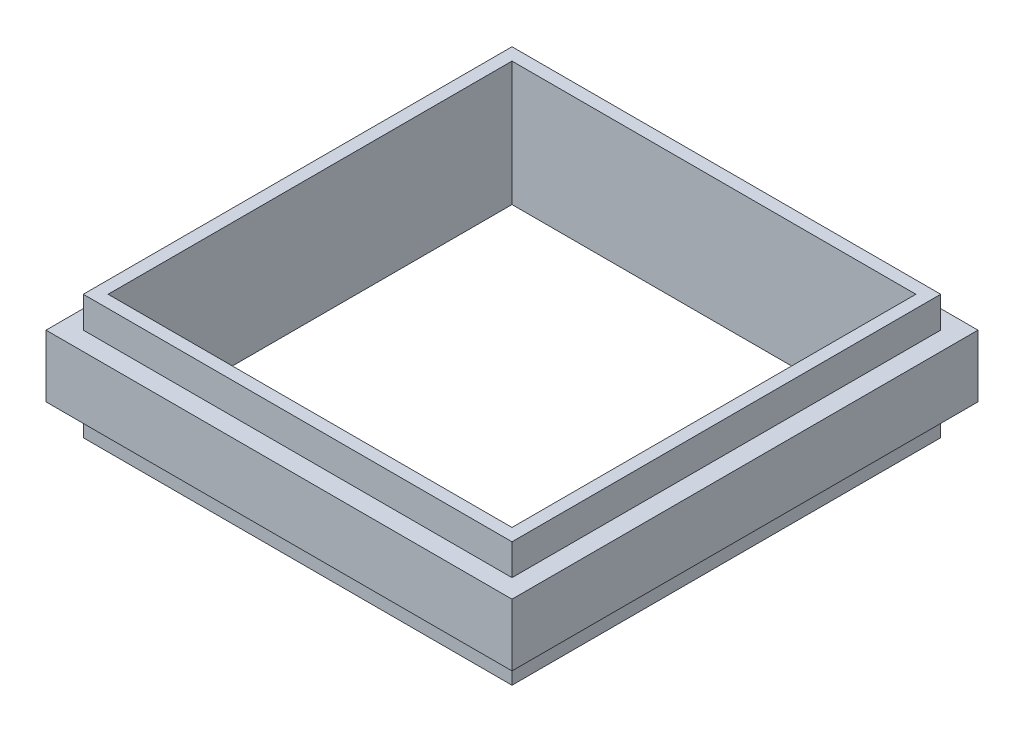
ISO-10303-21;
HEADER;
FILE_DESCRIPTION(('STEP AP214'),'2;1');
FILE_NAME('part.step','',(''),(''),'','','');
FILE_SCHEMA(('AUTOMOTIVE_DESIGN { 1 0 10303 214 1 1 1 1 }'));
ENDSEC;
DATA;
#1=APPLICATION_CONTEXT('core data for automotive mechanical design processes');
#2=APPLICATION_PROTOCOL_DEFINITION('international standard','automotive_design',2000,#1);
#3=PRODUCT_CONTEXT('',#1,'mechanical');
#4=PRODUCT('Part','Part','',(#3));
#5=PRODUCT_RELATED_PRODUCT_CATEGORY('part','',(#4));
#6=PRODUCT_DEFINITION_FORMATION('','',#4);
#7=PRODUCT_DEFINITION_CONTEXT('part definition',#1,'design');
#8=PRODUCT_DEFINITION('design','',#6,#7);
#9=PRODUCT_DEFINITION_SHAPE('','',#8);
#10=(LENGTH_UNIT() NAMED_UNIT(*) SI_UNIT(.MILLI.,.METRE.));
#11=(NAMED_UNIT(*) PLANE_ANGLE_UNIT() SI_UNIT($,.RADIAN.));
#12=(NAMED_UNIT(*) SI_UNIT($,.STERADIAN.) SOLID_ANGLE_UNIT());
#13=UNCERTAINTY_MEASURE_WITH_UNIT(LENGTH_MEASURE(1.E-05),#10,'distance_accuracy_value','');
#14=(GEOMETRIC_REPRESENTATION_CONTEXT(3) GLOBAL_UNCERTAINTY_ASSIGNED_CONTEXT((#13)) GLOBAL_UNIT_ASSIGNED_CONTEXT((#10,
#11,#12)) REPRESENTATION_CONTEXT('',''));
#15=CARTESIAN_POINT('',(0.,0.,0.));
#16=DIRECTION('',(0.,0.,1.));
#17=DIRECTION('',(1.,0.,0.));
#18=AXIS2_PLACEMENT_3D('',#15,#16,#17);
#19=CARTESIAN_POINT('',(0.,20.,0.));
#20=DIRECTION('',(0.,-1.,0.));
#21=DIRECTION('',(0.,0.,-1.));
#22=AXIS2_PLACEMENT_3D('',#19,#20,#21);
#23=PLANE('',#22);
#24=DIRECTION('',(0.,0.,-1.));
#25=VECTOR('',#24,1.);
#26=CARTESIAN_POINT('',(75.,20.,75.));
#27=LINE('',#26,#25);
#28=CARTESIAN_POINT('',(75.,20.,75.));
#29=VERTEX_POINT('',#28);
#30=CARTESIAN_POINT('',(75.,20.,-75.));
#31=VERTEX_POINT('',#30);
#32=EDGE_CURVE('E252',#29,#31,#27,.T.);
#33=ORIENTED_EDGE('',*,*,#32,.T.);
#34=DIRECTION('',(-1.,0.,0.));
#35=VECTOR('',#34,1.);
#36=CARTESIAN_POINT('',(-75.,20.,-75.));
#37=LINE('',#36,#35);
#38=CARTESIAN_POINT('',(-75.,20.,-75.));
#39=VERTEX_POINT('',#38);
#40=EDGE_CURVE('E255',#31,#39,#37,.T.);
#41=ORIENTED_EDGE('',*,*,#40,.T.);
#42=DIRECTION('',(0.,0.,1.));
#43=VECTOR('',#42,1.);
#44=CARTESIAN_POINT('',(-75.,20.,75.));
#45=LINE('',#44,#43);
#46=CARTESIAN_POINT('',(-75.,20.,75.));
#47=VERTEX_POINT('',#46);
#48=EDGE_CURVE('E258',#39,#47,#45,.T.);
#49=ORIENTED_EDGE('',*,*,#48,.T.);
#50=DIRECTION('',(1.,0.,0.));
#51=VECTOR('',#50,1.);
#52=CARTESIAN_POINT('',(-75.,20.,75.));
#53=LINE('',#52,#51);
#54=EDGE_CURVE('E260',#47,#29,#53,.T.);
#55=ORIENTED_EDGE('',*,*,#54,.T.);
#56=EDGE_LOOP('',(#33,#41,#49,#55));
#57=FACE_BOUND('',#56,.T.);
#58=DIRECTION('',(0.,0.,-1.));
#59=VECTOR('',#58,1.);
#60=CARTESIAN_POINT('',(69.,20.,69.));
#61=LINE('',#60,#59);
#62=CARTESIAN_POINT('',(69.,20.,69.));
#63=VERTEX_POINT('',#62);
#64=CARTESIAN_POINT('',(69.,20.,-69.));
#65=VERTEX_POINT('',#64);
#66=EDGE_CURVE('E218',#63,#65,#61,.T.);
#67=ORIENTED_EDGE('',*,*,#66,.F.);
#68=DIRECTION('',(1.,0.,0.));
#69=VECTOR('',#68,1.);
#70=CARTESIAN_POINT('',(-69.,20.,69.));
#71=LINE('',#70,#69);
#72=CARTESIAN_POINT('',(-69.,20.,69.));
#73=VERTEX_POINT('',#72);
#74=EDGE_CURVE('E223',#73,#63,#71,.T.);
#75=ORIENTED_EDGE('',*,*,#74,.F.);
#76=DIRECTION('',(0.,0.,1.));
#77=VECTOR('',#76,1.);
#78=CARTESIAN_POINT('',(-69.,20.,69.));
#79=LINE('',#78,#77);
#80=CARTESIAN_POINT('',(-69.,20.,-69.));
#81=VERTEX_POINT('',#80);
#82=EDGE_CURVE('E235',#81,#73,#79,.T.);
#83=ORIENTED_EDGE('',*,*,#82,.F.);
#84=DIRECTION('',(-1.,0.,0.));
#85=VECTOR('',#84,1.);
#86=CARTESIAN_POINT('',(-69.,20.,-69.));
#87=LINE('',#86,#85);
#88=EDGE_CURVE('E232',#65,#81,#87,.T.);
#89=ORIENTED_EDGE('',*,*,#88,.F.);
#90=EDGE_LOOP('',(#67,#75,#83,#89));
#91=FACE_BOUND('',#90,.T.);
#92=ADVANCED_FACE('F36',(#57,#91),#23,.F.);
#93=CARTESIAN_POINT('',(75.,20.,75.));
#94=DIRECTION('',(-1.,0.,0.));
#95=DIRECTION('',(0.,0.,1.));
#96=AXIS2_PLACEMENT_3D('',#93,#94,#95);
#97=PLANE('',#96);
#98=DIRECTION('',(0.,0.,-1.));
#99=VECTOR('',#98,1.);
#100=CARTESIAN_POINT('',(75.,0.,75.));
#101=LINE('',#100,#99);
#102=CARTESIAN_POINT('',(75.,0.,75.));
#103=VERTEX_POINT('',#102);
#104=CARTESIAN_POINT('',(75.,0.,-75.));
#105=VERTEX_POINT('',#104);
#106=EDGE_CURVE('E251',#103,#105,#101,.T.);
#107=ORIENTED_EDGE('',*,*,#106,.T.);
#108=DIRECTION('',(0.,-1.,0.));
#109=VECTOR('',#108,1.);
#110=CARTESIAN_POINT('',(75.,20.,-75.));
#111=LINE('',#110,#109);
#112=EDGE_CURVE('E11',#31,#105,#111,.T.);
#113=ORIENTED_EDGE('',*,*,#112,.F.);
#114=ORIENTED_EDGE('',*,*,#32,.F.);
#115=DIRECTION('',(0.,-1.,0.));
#116=VECTOR('',#115,1.);
#117=CARTESIAN_POINT('',(75.,20.,75.));
#118=LINE('',#117,#116);
#119=EDGE_CURVE('E262',#29,#103,#118,.T.);
#120=ORIENTED_EDGE('',*,*,#119,.T.);
#121=EDGE_LOOP('',(#107,#113,#114,#120));
#122=FACE_BOUND('',#121,.T.);
#123=ADVANCED_FACE('F38',(#122),#97,.F.);
#124=CARTESIAN_POINT('',(-75.,20.,-75.));
#125=DIRECTION('',(0.,0.,1.));
#126=DIRECTION('',(1.,0.,0.));
#127=AXIS2_PLACEMENT_3D('',#124,#125,#126);
#128=PLANE('',#127);
#129=DIRECTION('',(-1.,0.,0.));
#130=VECTOR('',#129,1.);
#131=CARTESIAN_POINT('',(-75.,0.,-75.));
#132=LINE('',#131,#130);
#133=CARTESIAN_POINT('',(-75.,0.,-75.));
#134=VERTEX_POINT('',#133);
#135=EDGE_CURVE('E265',#105,#134,#132,.T.);
#136=ORIENTED_EDGE('',*,*,#135,.T.);
#137=DIRECTION('',(0.,-1.,0.));
#138=VECTOR('',#137,1.);
#139=CARTESIAN_POINT('',(-75.,20.,-75.));
#140=LINE('',#139,#138);
#141=EDGE_CURVE('E44',#39,#134,#140,.T.);
#142=ORIENTED_EDGE('',*,*,#141,.F.);
#143=ORIENTED_EDGE('',*,*,#40,.F.);
#144=ORIENTED_EDGE('',*,*,#112,.T.);
#145=EDGE_LOOP('',(#136,#142,#143,#144));
#146=FACE_BOUND('',#145,.T.);
#147=ADVANCED_FACE('F295',(#146),#128,.F.);
#148=CARTESIAN_POINT('',(-75.,20.,75.));
#149=DIRECTION('',(1.,0.,0.));
#150=DIRECTION('',(0.,0.,-1.));
#151=AXIS2_PLACEMENT_3D('',#148,#149,#150);
#152=PLANE('',#151);
#153=DIRECTION('',(0.,0.,1.));
#154=VECTOR('',#153,1.);
#155=CARTESIAN_POINT('',(-75.,0.,75.));
#156=LINE('',#155,#154);
#157=CARTESIAN_POINT('',(-75.,0.,75.));
#158=VERTEX_POINT('',#157);
#159=EDGE_CURVE('E267',#134,#158,#156,.T.);
#160=ORIENTED_EDGE('',*,*,#159,.T.);
#161=DIRECTION('',(0.,-1.,0.));
#162=VECTOR('',#161,1.);
#163=CARTESIAN_POINT('',(-75.,20.,75.));
#164=LINE('',#163,#162);
#165=EDGE_CURVE('E272',#47,#158,#164,.T.);
#166=ORIENTED_EDGE('',*,*,#165,.F.);
#167=ORIENTED_EDGE('',*,*,#48,.F.);
#168=ORIENTED_EDGE('',*,*,#141,.T.);
#169=EDGE_LOOP('',(#160,#166,#167,#168));
#170=FACE_BOUND('',#169,.T.);
#171=ADVANCED_FACE('F279',(#170),#152,.F.);
#172=CARTESIAN_POINT('',(-75.,20.,75.));
#173=DIRECTION('',(0.,0.,-1.));
#174=DIRECTION('',(-1.,0.,0.));
#175=AXIS2_PLACEMENT_3D('',#172,#173,#174);
#176=PLANE('',#175);
#177=DIRECTION('',(1.,0.,0.));
#178=VECTOR('',#177,1.);
#179=CARTESIAN_POINT('',(-75.,0.,75.));
#180=LINE('',#179,#178);
#181=EDGE_CURVE('E256',#158,#103,#180,.T.);
#182=ORIENTED_EDGE('',*,*,#181,.T.);
#183=ORIENTED_EDGE('',*,*,#119,.F.);
#184=ORIENTED_EDGE('',*,*,#54,.F.);
#185=ORIENTED_EDGE('',*,*,#165,.T.);
#186=EDGE_LOOP('',(#182,#183,#184,#185));
#187=FACE_BOUND('',#186,.T.);
#188=ADVANCED_FACE('F288',(#187),#176,.F.);
#189=CARTESIAN_POINT('',(0.,0.,0.));
#190=DIRECTION('',(0.,-1.,0.));
#191=DIRECTION('',(0.,0.,-1.));
#192=AXIS2_PLACEMENT_3D('',#189,#190,#191);
#193=PLANE('',#192);
#194=DIRECTION('',(0.,0.,1.));
#195=VECTOR('',#194,1.);
#196=CARTESIAN_POINT('',(69.,0.,-69.));
#197=LINE('',#196,#195);
#198=CARTESIAN_POINT('',(69.,0.,-69.));
#199=VERTEX_POINT('',#198);
#200=CARTESIAN_POINT('',(69.,0.,69.));
#201=VERTEX_POINT('',#200);
#202=EDGE_CURVE('E182',#199,#201,#197,.T.);
#203=ORIENTED_EDGE('',*,*,#202,.F.);
#204=DIRECTION('',(1.,0.,0.));
#205=VECTOR('',#204,1.);
#206=CARTESIAN_POINT('',(-69.,0.,-69.));
#207=LINE('',#206,#205);
#208=CARTESIAN_POINT('',(-69.,0.,-69.));
#209=VERTEX_POINT('',#208);
#210=EDGE_CURVE('E190',#209,#199,#207,.T.);
#211=ORIENTED_EDGE('',*,*,#210,.F.);
#212=DIRECTION('',(0.,0.,-1.));
#213=VECTOR('',#212,1.);
#214=CARTESIAN_POINT('',(-69.,0.,-69.));
#215=LINE('',#214,#213);
#216=CARTESIAN_POINT('',(-69.,0.,69.));
#217=VERTEX_POINT('',#216);
#218=EDGE_CURVE('E202',#217,#209,#215,.T.);
#219=ORIENTED_EDGE('',*,*,#218,.F.);
#220=DIRECTION('',(-1.,0.,0.));
#221=VECTOR('',#220,1.);
#222=CARTESIAN_POINT('',(-69.,0.,69.));
#223=LINE('',#222,#221);
#224=EDGE_CURVE('E199',#201,#217,#223,.T.);
#225=ORIENTED_EDGE('',*,*,#224,.F.);
#226=EDGE_LOOP('',(#203,#211,#219,#225));
#227=FACE_BOUND('',#226,.T.);
#228=ORIENTED_EDGE('',*,*,#106,.F.);
#229=ORIENTED_EDGE('',*,*,#181,.F.);
#230=ORIENTED_EDGE('',*,*,#159,.F.);
#231=ORIENTED_EDGE('',*,*,#135,.F.);
#232=EDGE_LOOP('',(#228,#229,#230,#231));
#233=FACE_BOUND('',#232,.T.);
#234=ADVANCED_FACE('F285',(#227,#233),#193,.T.);
#235=CARTESIAN_POINT('',(69.,30.,69.));
#236=DIRECTION('',(-1.,0.,0.));
#237=DIRECTION('',(0.,0.,1.));
#238=AXIS2_PLACEMENT_3D('',#235,#236,#237);
#239=PLANE('',#238);
#240=ORIENTED_EDGE('',*,*,#66,.T.);
#241=DIRECTION('',(0.,-1.,0.));
#242=VECTOR('',#241,1.);
#243=CARTESIAN_POINT('',(69.,30.,-69.));
#244=LINE('',#243,#242);
#245=CARTESIAN_POINT('',(69.,30.,-69.));
#246=VERTEX_POINT('',#245);
#247=EDGE_CURVE('E248',#246,#65,#244,.T.);
#248=ORIENTED_EDGE('',*,*,#247,.F.);
#249=DIRECTION('',(0.,0.,-1.));
#250=VECTOR('',#249,1.);
#251=CARTESIAN_POINT('',(69.,30.,69.));
#252=LINE('',#251,#250);
#253=CARTESIAN_POINT('',(69.,30.,69.));
#254=VERTEX_POINT('',#253);
#255=EDGE_CURVE('E219',#254,#246,#252,.T.);
#256=ORIENTED_EDGE('',*,*,#255,.F.);
#257=DIRECTION('',(0.,-1.,0.));
#258=VECTOR('',#257,1.);
#259=CARTESIAN_POINT('',(69.,30.,69.));
#260=LINE('',#259,#258);
#261=EDGE_CURVE('E229',#254,#63,#260,.T.);
#262=ORIENTED_EDGE('',*,*,#261,.T.);
#263=EDGE_LOOP('',(#240,#248,#256,#262));
#264=FACE_BOUND('',#263,.T.);
#265=ADVANCED_FACE('F308',(#264),#239,.F.);
#266=CARTESIAN_POINT('',(-69.,30.,-69.));
#267=DIRECTION('',(0.,0.,1.));
#268=DIRECTION('',(1.,0.,0.));
#269=AXIS2_PLACEMENT_3D('',#266,#267,#268);
#270=PLANE('',#269);
#271=ORIENTED_EDGE('',*,*,#88,.T.);
#272=DIRECTION('',(0.,-1.,0.));
#273=VECTOR('',#272,1.);
#274=CARTESIAN_POINT('',(-69.,30.,-69.));
#275=LINE('',#274,#273);
#276=CARTESIAN_POINT('',(-69.,30.,-69.));
#277=VERTEX_POINT('',#276);
#278=EDGE_CURVE('E245',#277,#81,#275,.T.);
#279=ORIENTED_EDGE('',*,*,#278,.F.);
#280=DIRECTION('',(-1.,0.,0.));
#281=VECTOR('',#280,1.);
#282=CARTESIAN_POINT('',(-69.,30.,-69.));
#283=LINE('',#282,#281);
#284=EDGE_CURVE('E222',#246,#277,#283,.T.);
#285=ORIENTED_EDGE('',*,*,#284,.F.);
#286=ORIENTED_EDGE('',*,*,#247,.T.);
#287=EDGE_LOOP('',(#271,#279,#285,#286));
#288=FACE_BOUND('',#287,.T.);
#289=ADVANCED_FACE('F330',(#288),#270,.F.);
#290=CARTESIAN_POINT('',(-69.,30.,69.));
#291=DIRECTION('',(1.,0.,0.));
#292=DIRECTION('',(0.,0.,-1.));
#293=AXIS2_PLACEMENT_3D('',#290,#291,#292);
#294=PLANE('',#293);
#295=ORIENTED_EDGE('',*,*,#82,.T.);
#296=DIRECTION('',(0.,-1.,0.));
#297=VECTOR('',#296,1.);
#298=CARTESIAN_POINT('',(-69.,30.,69.));
#299=LINE('',#298,#297);
#300=CARTESIAN_POINT('',(-69.,30.,69.));
#301=VERTEX_POINT('',#300);
#302=EDGE_CURVE('E242',#301,#73,#299,.T.);
#303=ORIENTED_EDGE('',*,*,#302,.F.);
#304=DIRECTION('',(0.,0.,1.));
#305=VECTOR('',#304,1.);
#306=CARTESIAN_POINT('',(-69.,30.,69.));
#307=LINE('',#306,#305);
#308=EDGE_CURVE('E225',#277,#301,#307,.T.);
#309=ORIENTED_EDGE('',*,*,#308,.F.);
#310=ORIENTED_EDGE('',*,*,#278,.T.);
#311=EDGE_LOOP('',(#295,#303,#309,#310));
#312=FACE_BOUND('',#311,.T.);
#313=ADVANCED_FACE('F337',(#312),#294,.F.);
#314=CARTESIAN_POINT('',(-69.,30.,69.));
#315=DIRECTION('',(0.,0.,-1.));
#316=DIRECTION('',(-1.,0.,0.));
#317=AXIS2_PLACEMENT_3D('',#314,#315,#316);
#318=PLANE('',#317);
#319=ORIENTED_EDGE('',*,*,#74,.T.);
#320=ORIENTED_EDGE('',*,*,#261,.F.);
#321=DIRECTION('',(1.,0.,0.));
#322=VECTOR('',#321,1.);
#323=CARTESIAN_POINT('',(-69.,30.,69.));
#324=LINE('',#323,#322);
#325=EDGE_CURVE('E227',#301,#254,#324,.T.);
#326=ORIENTED_EDGE('',*,*,#325,.F.);
#327=ORIENTED_EDGE('',*,*,#302,.T.);
#328=EDGE_LOOP('',(#319,#320,#326,#327));
#329=FACE_BOUND('',#328,.T.);
#330=ADVANCED_FACE('F344',(#329),#318,.F.);
#331=CARTESIAN_POINT('',(0.,30.,0.));
#332=DIRECTION('',(0.,-1.,0.));
#333=DIRECTION('',(0.,0.,-1.));
#334=AXIS2_PLACEMENT_3D('',#331,#332,#333);
#335=PLANE('',#334);
#336=DIRECTION('',(1.,0.,0.));
#337=VECTOR('',#336,1.);
#338=CARTESIAN_POINT('',(65.,30.,65.));
#339=LINE('',#338,#337);
#340=CARTESIAN_POINT('',(-65.,30.,65.));
#341=VERTEX_POINT('',#340);
#342=CARTESIAN_POINT('',(65.,30.,65.));
#343=VERTEX_POINT('',#342);
#344=EDGE_CURVE('E176',#341,#343,#339,.T.);
#345=ORIENTED_EDGE('',*,*,#344,.F.);
#346=DIRECTION('',(0.,0.,1.));
#347=VECTOR('',#346,1.);
#348=CARTESIAN_POINT('',(-65.,30.,-65.));
#349=LINE('',#348,#347);
#350=CARTESIAN_POINT('',(-65.,30.,-65.));
#351=VERTEX_POINT('',#350);
#352=EDGE_CURVE('E51',#351,#341,#349,.T.);
#353=ORIENTED_EDGE('',*,*,#352,.F.);
#354=DIRECTION('',(-1.,0.,0.));
#355=VECTOR('',#354,1.);
#356=CARTESIAN_POINT('',(65.,30.,-65.));
#357=LINE('',#356,#355);
#358=CARTESIAN_POINT('',(65.,30.,-65.));
#359=VERTEX_POINT('',#358);
#360=EDGE_CURVE('E167',#359,#351,#357,.T.);
#361=ORIENTED_EDGE('',*,*,#360,.F.);
#362=DIRECTION('',(0.,0.,-1.));
#363=VECTOR('',#362,1.);
#364=CARTESIAN_POINT('',(65.,30.,-65.));
#365=LINE('',#364,#363);
#366=EDGE_CURVE('E170',#343,#359,#365,.T.);
#367=ORIENTED_EDGE('',*,*,#366,.F.);
#368=EDGE_LOOP('',(#345,#353,#361,#367));
#369=FACE_BOUND('',#368,.T.);
#370=ORIENTED_EDGE('',*,*,#255,.T.);
#371=ORIENTED_EDGE('',*,*,#284,.T.);
#372=ORIENTED_EDGE('',*,*,#308,.T.);
#373=ORIENTED_EDGE('',*,*,#325,.T.);
#374=EDGE_LOOP('',(#370,#371,#372,#373));
#375=FACE_BOUND('',#374,.T.);
#376=ADVANCED_FACE('F351',(#369,#375),#335,.F.);
#377=CARTESIAN_POINT('',(69.,-10.,-69.));
#378=DIRECTION('',(-1.,0.,0.));
#379=DIRECTION('',(0.,0.,1.));
#380=AXIS2_PLACEMENT_3D('',#377,#378,#379);
#381=PLANE('',#380);
#382=ORIENTED_EDGE('',*,*,#202,.T.);
#383=DIRECTION('',(0.,1.,0.));
#384=VECTOR('',#383,1.);
#385=CARTESIAN_POINT('',(69.,-10.,69.));
#386=LINE('',#385,#384);
#387=CARTESIAN_POINT('',(69.,-10.,69.));
#388=VERTEX_POINT('',#387);
#389=EDGE_CURVE('E215',#388,#201,#386,.T.);
#390=ORIENTED_EDGE('',*,*,#389,.F.);
#391=DIRECTION('',(0.,0.,1.));
#392=VECTOR('',#391,1.);
#393=CARTESIAN_POINT('',(69.,-10.,-69.));
#394=LINE('',#393,#392);
#395=CARTESIAN_POINT('',(69.,-10.,-69.));
#396=VERTEX_POINT('',#395);
#397=EDGE_CURVE('E186',#396,#388,#394,.T.);
#398=ORIENTED_EDGE('',*,*,#397,.F.);
#399=DIRECTION('',(0.,1.,0.));
#400=VECTOR('',#399,1.);
#401=CARTESIAN_POINT('',(69.,-10.,-69.));
#402=LINE('',#401,#400);
#403=EDGE_CURVE('E196',#396,#199,#402,.T.);
#404=ORIENTED_EDGE('',*,*,#403,.T.);
#405=EDGE_LOOP('',(#382,#390,#398,#404));
#406=FACE_BOUND('',#405,.T.);
#407=ADVANCED_FACE('F359',(#406),#381,.F.);
#408=CARTESIAN_POINT('',(-69.,-10.,69.));
#409=DIRECTION('',(0.,0.,-1.));
#410=DIRECTION('',(-1.,0.,0.));
#411=AXIS2_PLACEMENT_3D('',#408,#409,#410);
#412=PLANE('',#411);
#413=ORIENTED_EDGE('',*,*,#224,.T.);
#414=DIRECTION('',(0.,1.,0.));
#415=VECTOR('',#414,1.);
#416=CARTESIAN_POINT('',(-69.,-10.,69.));
#417=LINE('',#416,#415);
#418=CARTESIAN_POINT('',(-69.,-10.,69.));
#419=VERTEX_POINT('',#418);
#420=EDGE_CURVE('E212',#419,#217,#417,.T.);
#421=ORIENTED_EDGE('',*,*,#420,.F.);
#422=DIRECTION('',(-1.,0.,0.));
#423=VECTOR('',#422,1.);
#424=CARTESIAN_POINT('',(-69.,-10.,69.));
#425=LINE('',#424,#423);
#426=EDGE_CURVE('E189',#388,#419,#425,.T.);
#427=ORIENTED_EDGE('',*,*,#426,.F.);
#428=ORIENTED_EDGE('',*,*,#389,.T.);
#429=EDGE_LOOP('',(#413,#421,#427,#428));
#430=FACE_BOUND('',#429,.T.);
#431=ADVANCED_FACE('F368',(#430),#412,.F.);
#432=CARTESIAN_POINT('',(-69.,-10.,-69.));
#433=DIRECTION('',(1.,0.,0.));
#434=DIRECTION('',(0.,0.,-1.));
#435=AXIS2_PLACEMENT_3D('',#432,#433,#434);
#436=PLANE('',#435);
#437=ORIENTED_EDGE('',*,*,#218,.T.);
#438=DIRECTION('',(0.,1.,0.));
#439=VECTOR('',#438,1.);
#440=CARTESIAN_POINT('',(-69.,-10.,-69.));
#441=LINE('',#440,#439);
#442=CARTESIAN_POINT('',(-69.,-10.,-69.));
#443=VERTEX_POINT('',#442);
#444=EDGE_CURVE('E209',#443,#209,#441,.T.);
#445=ORIENTED_EDGE('',*,*,#444,.F.);
#446=DIRECTION('',(0.,0.,-1.));
#447=VECTOR('',#446,1.);
#448=CARTESIAN_POINT('',(-69.,-10.,-69.));
#449=LINE('',#448,#447);
#450=EDGE_CURVE('E192',#419,#443,#449,.T.);
#451=ORIENTED_EDGE('',*,*,#450,.F.);
#452=ORIENTED_EDGE('',*,*,#420,.T.);
#453=EDGE_LOOP('',(#437,#445,#451,#452));
#454=FACE_BOUND('',#453,.T.);
#455=ADVANCED_FACE('F376',(#454),#436,.F.);
#456=CARTESIAN_POINT('',(-69.,-10.,-69.));
#457=DIRECTION('',(0.,0.,1.));
#458=DIRECTION('',(1.,0.,0.));
#459=AXIS2_PLACEMENT_3D('',#456,#457,#458);
#460=PLANE('',#459);
#461=ORIENTED_EDGE('',*,*,#210,.T.);
#462=ORIENTED_EDGE('',*,*,#403,.F.);
#463=DIRECTION('',(1.,0.,0.));
#464=VECTOR('',#463,1.);
#465=CARTESIAN_POINT('',(-69.,-10.,-69.));
#466=LINE('',#465,#464);
#467=EDGE_CURVE('E194',#443,#396,#466,.T.);
#468=ORIENTED_EDGE('',*,*,#467,.F.);
#469=ORIENTED_EDGE('',*,*,#444,.T.);
#470=EDGE_LOOP('',(#461,#462,#468,#469));
#471=FACE_BOUND('',#470,.T.);
#472=ADVANCED_FACE('F384',(#471),#460,.F.);
#473=CARTESIAN_POINT('',(0.,-10.,0.));
#474=DIRECTION('',(0.,1.,0.));
#475=DIRECTION('',(0.,0.,1.));
#476=AXIS2_PLACEMENT_3D('',#473,#474,#475);
#477=PLANE('',#476);
#478=DIRECTION('',(-1.,0.,0.));
#479=VECTOR('',#478,1.);
#480=CARTESIAN_POINT('',(65.,-10.,-65.));
#481=LINE('',#480,#479);
#482=CARTESIAN_POINT('',(65.,-10.,-65.));
#483=VERTEX_POINT('',#482);
#484=CARTESIAN_POINT('',(-65.,-10.,-65.));
#485=VERTEX_POINT('',#484);
#486=EDGE_CURVE('E157',#483,#485,#481,.T.);
#487=ORIENTED_EDGE('',*,*,#486,.T.);
#488=DIRECTION('',(0.,0.,1.));
#489=VECTOR('',#488,1.);
#490=CARTESIAN_POINT('',(-65.,-10.,-65.));
#491=LINE('',#490,#489);
#492=CARTESIAN_POINT('',(-65.,-10.,65.));
#493=VERTEX_POINT('',#492);
#494=EDGE_CURVE('E151',#485,#493,#491,.T.);
#495=ORIENTED_EDGE('',*,*,#494,.T.);
#496=DIRECTION('',(1.,0.,0.));
#497=VECTOR('',#496,1.);
#498=CARTESIAN_POINT('',(65.,-10.,65.));
#499=LINE('',#498,#497);
#500=CARTESIAN_POINT('',(65.,-10.,65.));
#501=VERTEX_POINT('',#500);
#502=EDGE_CURVE('E160',#493,#501,#499,.T.);
#503=ORIENTED_EDGE('',*,*,#502,.T.);
#504=DIRECTION('',(0.,0.,-1.));
#505=VECTOR('',#504,1.);
#506=CARTESIAN_POINT('',(65.,-10.,-65.));
#507=LINE('',#506,#505);
#508=EDGE_CURVE('E59',#501,#483,#507,.T.);
#509=ORIENTED_EDGE('',*,*,#508,.T.);
#510=EDGE_LOOP('',(#487,#495,#503,#509));
#511=FACE_BOUND('',#510,.T.);
#512=ORIENTED_EDGE('',*,*,#397,.T.);
#513=ORIENTED_EDGE('',*,*,#426,.T.);
#514=ORIENTED_EDGE('',*,*,#450,.T.);
#515=ORIENTED_EDGE('',*,*,#467,.T.);
#516=EDGE_LOOP('',(#512,#513,#514,#515));
#517=FACE_BOUND('',#516,.T.);
#518=ADVANCED_FACE('F164',(#511,#517),#477,.F.);
#519=CARTESIAN_POINT('',(-65.,-10.,-65.));
#520=DIRECTION('',(-1.,0.,0.));
#521=DIRECTION('',(0.,0.,1.));
#522=AXIS2_PLACEMENT_3D('',#519,#520,#521);
#523=PLANE('',#522);
#524=ORIENTED_EDGE('',*,*,#352,.T.);
#525=DIRECTION('',(0.,1.,0.));
#526=VECTOR('',#525,1.);
#527=CARTESIAN_POINT('',(-65.,-10.,65.));
#528=LINE('',#527,#526);
#529=EDGE_CURVE('E147',#493,#341,#528,.T.);
#530=ORIENTED_EDGE('',*,*,#529,.F.);
#531=ORIENTED_EDGE('',*,*,#494,.F.);
#532=DIRECTION('',(0.,1.,0.));
#533=VECTOR('',#532,1.);
#534=CARTESIAN_POINT('',(-65.,-10.,-65.));
#535=LINE('',#534,#533);
#536=EDGE_CURVE('E180',#485,#351,#535,.T.);
#537=ORIENTED_EDGE('',*,*,#536,.T.);
#538=EDGE_LOOP('',(#524,#530,#531,#537));
#539=FACE_BOUND('',#538,.T.);
#540=ADVANCED_FACE('F149',(#539),#523,.F.);
#541=CARTESIAN_POINT('',(65.,-10.,-65.));
#542=DIRECTION('',(0.,0.,-1.));
#543=DIRECTION('',(-1.,0.,0.));
#544=AXIS2_PLACEMENT_3D('',#541,#542,#543);
#545=PLANE('',#544);
#546=ORIENTED_EDGE('',*,*,#360,.T.);
#547=ORIENTED_EDGE('',*,*,#536,.F.);
#548=ORIENTED_EDGE('',*,*,#486,.F.);
#549=DIRECTION('',(0.,1.,0.));
#550=VECTOR('',#549,1.);
#551=CARTESIAN_POINT('',(65.,-10.,-65.));
#552=LINE('',#551,#550);
#553=EDGE_CURVE('E183',#483,#359,#552,.T.);
#554=ORIENTED_EDGE('',*,*,#553,.T.);
#555=EDGE_LOOP('',(#546,#547,#548,#554));
#556=FACE_BOUND('',#555,.T.);
#557=ADVANCED_FACE('F403',(#556),#545,.F.);
#558=CARTESIAN_POINT('',(65.,-10.,-65.));
#559=DIRECTION('',(1.,0.,0.));
#560=DIRECTION('',(0.,0.,-1.));
#561=AXIS2_PLACEMENT_3D('',#558,#559,#560);
#562=PLANE('',#561);
#563=ORIENTED_EDGE('',*,*,#366,.T.);
#564=ORIENTED_EDGE('',*,*,#553,.F.);
#565=ORIENTED_EDGE('',*,*,#508,.F.);
#566=DIRECTION('',(0.,1.,0.));
#567=VECTOR('',#566,1.);
#568=CARTESIAN_POINT('',(65.,-10.,65.));
#569=LINE('',#568,#567);
#570=EDGE_CURVE('E156',#501,#343,#569,.T.);
#571=ORIENTED_EDGE('',*,*,#570,.T.);
#572=EDGE_LOOP('',(#563,#564,#565,#571));
#573=FACE_BOUND('',#572,.T.);
#574=ADVANCED_FACE('F410',(#573),#562,.F.);
#575=CARTESIAN_POINT('',(65.,-10.,65.));
#576=DIRECTION('',(0.,0.,1.));
#577=DIRECTION('',(1.,0.,0.));
#578=AXIS2_PLACEMENT_3D('',#575,#576,#577);
#579=PLANE('',#578);
#580=ORIENTED_EDGE('',*,*,#344,.T.);
#581=ORIENTED_EDGE('',*,*,#570,.F.);
#582=ORIENTED_EDGE('',*,*,#502,.F.);
#583=ORIENTED_EDGE('',*,*,#529,.T.);
#584=EDGE_LOOP('',(#580,#581,#582,#583));
#585=FACE_BOUND('',#584,.T.);
#586=ADVANCED_FACE('F161',(#585),#579,.F.);
#587=CLOSED_SHELL('',(#92,#123,#147,#171,#188,#234,#265,#289,#313,#330,#376,#407,#431,#455,#472,
#518,#540,#557,#574,#586));
#588=MANIFOLD_SOLID_BREP('B2',#587);
#589=ADVANCED_BREP_SHAPE_REPRESENTATION('',(#18,#588),#14);
#590=SHAPE_DEFINITION_REPRESENTATION(#9,#589);
ENDSEC;
END-ISO-10303-21;
